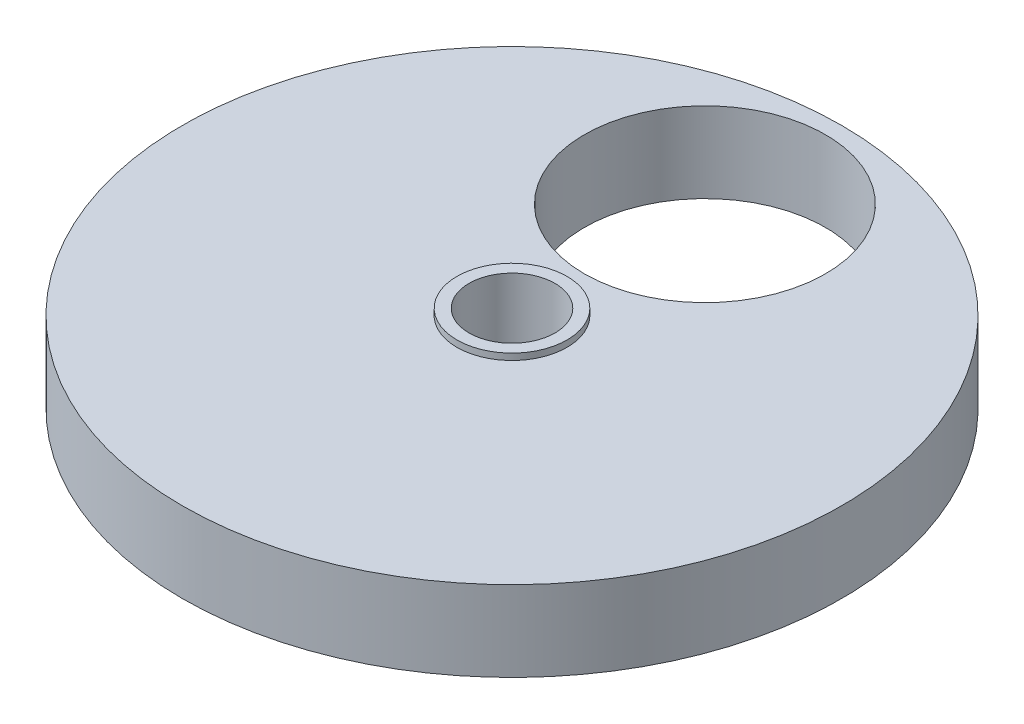
ISO-10303-21;
HEADER;
FILE_DESCRIPTION(('STEP AP214'),'2;1');
FILE_NAME('part.step','',(''),(''),'','','');
FILE_SCHEMA(('AUTOMOTIVE_DESIGN { 1 0 10303 214 1 1 1 1 }'));
ENDSEC;
DATA;
#1=APPLICATION_CONTEXT('core data for automotive mechanical design processes');
#2=APPLICATION_PROTOCOL_DEFINITION('international standard','automotive_design',2000,#1);
#3=PRODUCT_CONTEXT('',#1,'mechanical');
#4=PRODUCT('Part','Part','',(#3));
#5=PRODUCT_RELATED_PRODUCT_CATEGORY('part','',(#4));
#6=PRODUCT_DEFINITION_FORMATION('','',#4);
#7=PRODUCT_DEFINITION_CONTEXT('part definition',#1,'design');
#8=PRODUCT_DEFINITION('design','',#6,#7);
#9=PRODUCT_DEFINITION_SHAPE('','',#8);
#10=(LENGTH_UNIT() NAMED_UNIT(*) SI_UNIT(.MILLI.,.METRE.));
#11=(NAMED_UNIT(*) PLANE_ANGLE_UNIT() SI_UNIT($,.RADIAN.));
#12=(NAMED_UNIT(*) SI_UNIT($,.STERADIAN.) SOLID_ANGLE_UNIT());
#13=UNCERTAINTY_MEASURE_WITH_UNIT(LENGTH_MEASURE(1.E-05),#10,'distance_accuracy_value','');
#14=(GEOMETRIC_REPRESENTATION_CONTEXT(3) GLOBAL_UNCERTAINTY_ASSIGNED_CONTEXT((#13)) GLOBAL_UNIT_ASSIGNED_CONTEXT((#10,
#11,#12)) REPRESENTATION_CONTEXT('',''));
#15=CARTESIAN_POINT('',(0.,0.,0.));
#16=DIRECTION('',(0.,0.,1.));
#17=DIRECTION('',(1.,0.,0.));
#18=AXIS2_PLACEMENT_3D('',#15,#16,#17);
#19=CARTESIAN_POINT('',(0.,5.,0.));
#20=DIRECTION('',(0.,1.,0.));
#21=DIRECTION('',(0.,0.,1.));
#22=AXIS2_PLACEMENT_3D('',#19,#20,#21);
#23=PLANE('',#22);
#24=CARTESIAN_POINT('',(0.,5.,-12.));
#25=DIRECTION('',(0.,1.,0.));
#26=DIRECTION('',(0.,0.,1.));
#27=AXIS2_PLACEMENT_3D('',#24,#25,#26);
#28=CIRCLE('',#27,7.5);
#29=CARTESIAN_POINT('',(0.,5.,-4.5));
#30=VERTEX_POINT('',#29);
#31=EDGE_CURVE('E68',#30,#30,#28,.T.);
#32=ORIENTED_EDGE('',*,*,#31,.F.);
#33=EDGE_LOOP('',(#32));
#34=FACE_BOUND('',#33,.T.);
#35=CARTESIAN_POINT('',(0.,5.,0.));
#36=DIRECTION('',(0.,1.,0.));
#37=DIRECTION('',(0.,0.,1.));
#38=AXIS2_PLACEMENT_3D('',#35,#36,#37);
#39=CIRCLE('',#38,20.5);
#40=CARTESIAN_POINT('',(0.,5.,20.5));
#41=VERTEX_POINT('',#40);
#42=EDGE_CURVE('E10',#41,#41,#39,.T.);
#43=ORIENTED_EDGE('',*,*,#42,.T.);
#44=EDGE_LOOP('',(#43));
#45=FACE_BOUND('',#44,.T.);
#46=CARTESIAN_POINT('',(0.,5.,0.));
#47=DIRECTION('',(0.,1.,0.));
#48=DIRECTION('',(0.,0.,1.));
#49=AXIS2_PLACEMENT_3D('',#46,#47,#48);
#50=CIRCLE('',#49,3.425);
#51=CARTESIAN_POINT('',(0.,5.,3.425));
#52=VERTEX_POINT('',#51);
#53=EDGE_CURVE('E56',#52,#52,#50,.T.);
#54=ORIENTED_EDGE('',*,*,#53,.F.);
#55=EDGE_LOOP('',(#54));
#56=FACE_BOUND('',#55,.T.);
#57=ADVANCED_FACE('F37',(#34,#45,#56),#23,.T.);
#58=CARTESIAN_POINT('',(0.,5.,0.));
#59=DIRECTION('',(0.,-1.,0.));
#60=DIRECTION('',(0.,0.,-1.));
#61=AXIS2_PLACEMENT_3D('',#58,#59,#60);
#62=CYLINDRICAL_SURFACE('',#61,20.5);
#63=ORIENTED_EDGE('',*,*,#42,.F.);
#64=EDGE_LOOP('',(#63));
#65=FACE_BOUND('',#64,.T.);
#66=CARTESIAN_POINT('',(0.,0.,0.));
#67=DIRECTION('',(0.,1.,0.));
#68=DIRECTION('',(0.,0.,1.));
#69=AXIS2_PLACEMENT_3D('',#66,#67,#68);
#70=CIRCLE('',#69,20.5);
#71=CARTESIAN_POINT('',(0.,0.,20.5));
#72=VERTEX_POINT('',#71);
#73=EDGE_CURVE('E41',#72,#72,#70,.T.);
#74=ORIENTED_EDGE('',*,*,#73,.T.);
#75=EDGE_LOOP('',(#74));
#76=FACE_BOUND('',#75,.T.);
#77=ADVANCED_FACE('F39',(#65,#76),#62,.T.);
#78=CARTESIAN_POINT('',(0.,0.,0.));
#79=DIRECTION('',(0.,1.,0.));
#80=DIRECTION('',(0.,0.,1.));
#81=AXIS2_PLACEMENT_3D('',#78,#79,#80);
#82=PLANE('',#81);
#83=CARTESIAN_POINT('',(0.,0.,-12.));
#84=DIRECTION('',(0.,1.,0.));
#85=DIRECTION('',(0.,0.,1.));
#86=AXIS2_PLACEMENT_3D('',#83,#84,#85);
#87=CIRCLE('',#86,7.5);
#88=CARTESIAN_POINT('',(0.,0.,-4.5));
#89=VERTEX_POINT('',#88);
#90=EDGE_CURVE('E67',#89,#89,#87,.T.);
#91=ORIENTED_EDGE('',*,*,#90,.T.);
#92=EDGE_LOOP('',(#91));
#93=FACE_BOUND('',#92,.T.);
#94=CARTESIAN_POINT('',(0.,0.,0.));
#95=DIRECTION('',(0.,1.,0.));
#96=DIRECTION('',(0.,0.,1.));
#97=AXIS2_PLACEMENT_3D('',#94,#95,#96);
#98=CIRCLE('',#97,2.675);
#99=CARTESIAN_POINT('',(0.,0.,2.675));
#100=VERTEX_POINT('',#99);
#101=EDGE_CURVE('E50',#100,#100,#98,.T.);
#102=ORIENTED_EDGE('',*,*,#101,.T.);
#103=EDGE_LOOP('',(#102));
#104=FACE_BOUND('',#103,.T.);
#105=ORIENTED_EDGE('',*,*,#73,.F.);
#106=EDGE_LOOP('',(#105));
#107=FACE_BOUND('',#106,.T.);
#108=ADVANCED_FACE('F76',(#93,#104,#107),#82,.F.);
#109=CARTESIAN_POINT('',(0.,0.,0.));
#110=DIRECTION('',(0.,1.,0.));
#111=DIRECTION('',(0.,0.,1.));
#112=AXIS2_PLACEMENT_3D('',#109,#110,#111);
#113=CYLINDRICAL_SURFACE('',#112,2.675);
#114=ORIENTED_EDGE('',*,*,#101,.F.);
#115=EDGE_LOOP('',(#114));
#116=FACE_BOUND('',#115,.T.);
#117=CARTESIAN_POINT('',(0.,5.4,0.));
#118=DIRECTION('',(0.,1.,0.));
#119=DIRECTION('',(0.,0.,1.));
#120=AXIS2_PLACEMENT_3D('',#117,#118,#119);
#121=CIRCLE('',#120,2.675);
#122=CARTESIAN_POINT('',(0.,5.4,2.675));
#123=VERTEX_POINT('',#122);
#124=EDGE_CURVE('E60',#123,#123,#121,.T.);
#125=ORIENTED_EDGE('',*,*,#124,.T.);
#126=EDGE_LOOP('',(#125));
#127=FACE_BOUND('',#126,.T.);
#128=ADVANCED_FACE('F98',(#116,#127),#113,.F.);
#129=CARTESIAN_POINT('',(0.,5.4,0.));
#130=DIRECTION('',(0.,1.,0.));
#131=DIRECTION('',(0.,0.,1.));
#132=AXIS2_PLACEMENT_3D('',#129,#130,#131);
#133=PLANE('',#132);
#134=CARTESIAN_POINT('',(0.,5.4,0.));
#135=DIRECTION('',(0.,1.,0.));
#136=DIRECTION('',(0.,0.,1.));
#137=AXIS2_PLACEMENT_3D('',#134,#135,#136);
#138=CIRCLE('',#137,3.425);
#139=CARTESIAN_POINT('',(0.,5.4,3.425));
#140=VERTEX_POINT('',#139);
#141=EDGE_CURVE('E55',#140,#140,#138,.T.);
#142=ORIENTED_EDGE('',*,*,#141,.T.);
#143=EDGE_LOOP('',(#142));
#144=FACE_BOUND('',#143,.T.);
#145=ORIENTED_EDGE('',*,*,#124,.F.);
#146=EDGE_LOOP('',(#145));
#147=FACE_BOUND('',#146,.T.);
#148=ADVANCED_FACE('F92',(#144,#147),#133,.T.);
#149=CARTESIAN_POINT('',(0.,5.4,0.));
#150=DIRECTION('',(0.,-1.,0.));
#151=DIRECTION('',(0.,0.,-1.));
#152=AXIS2_PLACEMENT_3D('',#149,#150,#151);
#153=CYLINDRICAL_SURFACE('',#152,3.425);
#154=ORIENTED_EDGE('',*,*,#141,.F.);
#155=EDGE_LOOP('',(#154));
#156=FACE_BOUND('',#155,.T.);
#157=ORIENTED_EDGE('',*,*,#53,.T.);
#158=EDGE_LOOP('',(#157));
#159=FACE_BOUND('',#158,.T.);
#160=ADVANCED_FACE('F82',(#156,#159),#153,.T.);
#161=CARTESIAN_POINT('',(0.,0.,-12.));
#162=DIRECTION('',(0.,1.,0.));
#163=DIRECTION('',(0.,0.,1.));
#164=AXIS2_PLACEMENT_3D('',#161,#162,#163);
#165=CYLINDRICAL_SURFACE('',#164,7.5);
#166=ORIENTED_EDGE('',*,*,#90,.F.);
#167=EDGE_LOOP('',(#166));
#168=FACE_BOUND('',#167,.T.);
#169=ORIENTED_EDGE('',*,*,#31,.T.);
#170=EDGE_LOOP('',(#169));
#171=FACE_BOUND('',#170,.T.);
#172=ADVANCED_FACE('F79',(#168,#171),#165,.F.);
#173=CLOSED_SHELL('',(#57,#77,#108,#128,#148,#160,#172));
#174=MANIFOLD_SOLID_BREP('B2',#173);
#175=ADVANCED_BREP_SHAPE_REPRESENTATION('',(#18,#174),#14);
#176=SHAPE_DEFINITION_REPRESENTATION(#9,#175);
ENDSEC;
END-ISO-10303-21;
